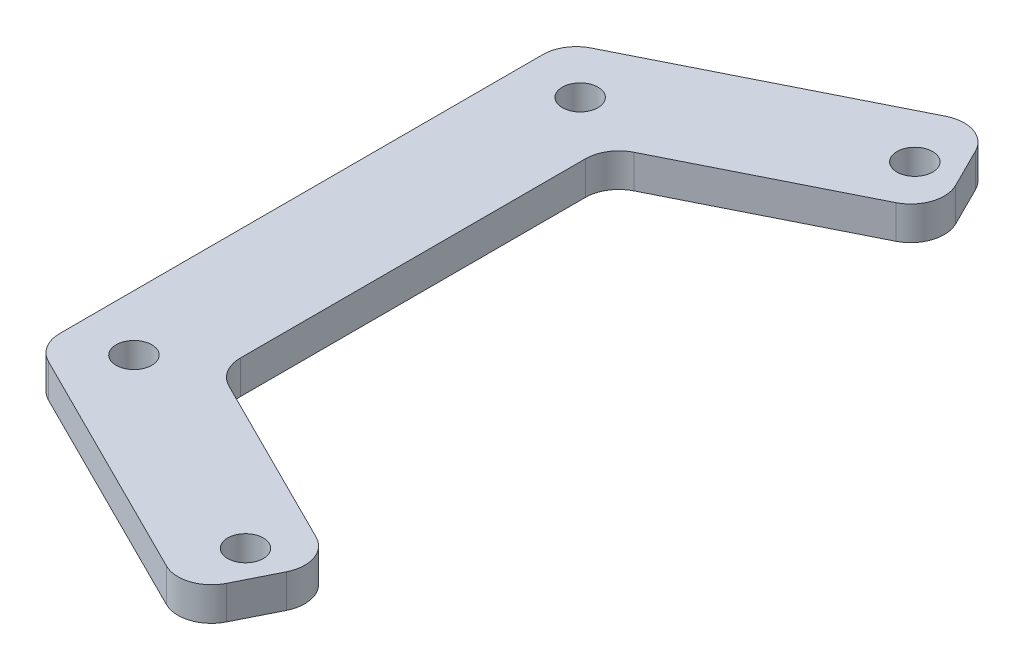
ISO-10303-21;
HEADER;
FILE_DESCRIPTION(('STEP AP214'),'2;1');
FILE_NAME('part.step','',(''),(''),'','','');
FILE_SCHEMA(('AUTOMOTIVE_DESIGN { 1 0 10303 214 1 1 1 1 }'));
ENDSEC;
DATA;
#1=APPLICATION_CONTEXT('core data for automotive mechanical design processes');
#2=APPLICATION_PROTOCOL_DEFINITION('international standard','automotive_design',2000,#1);
#3=PRODUCT_CONTEXT('',#1,'mechanical');
#4=PRODUCT('Part','Part','',(#3));
#5=PRODUCT_RELATED_PRODUCT_CATEGORY('part','',(#4));
#6=PRODUCT_DEFINITION_FORMATION('','',#4);
#7=PRODUCT_DEFINITION_CONTEXT('part definition',#1,'design');
#8=PRODUCT_DEFINITION('design','',#6,#7);
#9=PRODUCT_DEFINITION_SHAPE('','',#8);
#10=(LENGTH_UNIT() NAMED_UNIT(*) SI_UNIT(.MILLI.,.METRE.));
#11=(NAMED_UNIT(*) PLANE_ANGLE_UNIT() SI_UNIT($,.RADIAN.));
#12=(NAMED_UNIT(*) SI_UNIT($,.STERADIAN.) SOLID_ANGLE_UNIT());
#13=UNCERTAINTY_MEASURE_WITH_UNIT(LENGTH_MEASURE(1.E-05),#10,'distance_accuracy_value','');
#14=(GEOMETRIC_REPRESENTATION_CONTEXT(3) GLOBAL_UNCERTAINTY_ASSIGNED_CONTEXT((#13)) GLOBAL_UNIT_ASSIGNED_CONTEXT((#10,
#11,#12)) REPRESENTATION_CONTEXT('',''));
#15=CARTESIAN_POINT('',(0.,0.,0.));
#16=DIRECTION('',(0.,0.,1.));
#17=DIRECTION('',(1.,0.,0.));
#18=AXIS2_PLACEMENT_3D('',#15,#16,#17);
#19=CARTESIAN_POINT('',(-5.92786404500042,3.,11.8557280900009));
#20=DIRECTION('',(-0.447213595499957,0.,0.894427190999916));
#21=DIRECTION('',(0.894427190999916,0.,0.447213595499957));
#22=AXIS2_PLACEMENT_3D('',#19,#20,#21);
#23=PLANE('',#22);
#24=DIRECTION('',(-0.894427190999916,0.,-0.447213595499957));
#25=VECTOR('',#24,1.);
#26=CARTESIAN_POINT('',(-5.92786404500042,0.,11.8557280900009));
#27=LINE('',#26,#25);
#28=CARTESIAN_POINT('',(22.3167184270003,0.,25.9780193260012));
#29=VERTEX_POINT('',#28);
#30=CARTESIAN_POINT('',(6.65835921350013,0.,18.1488397192511));
#31=VERTEX_POINT('',#30);
#32=EDGE_CURVE('E257',#29,#31,#27,.T.);
#33=ORIENTED_EDGE('',*,*,#32,.T.);
#34=DIRECTION('',(0.,-1.,0.));
#35=VECTOR('',#34,1.);
#36=CARTESIAN_POINT('',(6.65835921350013,3.,18.1488397192511));
#37=LINE('',#36,#35);
#38=CARTESIAN_POINT('',(6.65835921350013,3.,18.1488397192511));
#39=VERTEX_POINT('',#38);
#40=EDGE_CURVE('E228',#31,#39,#37,.F.);
#41=ORIENTED_EDGE('',*,*,#40,.T.);
#42=DIRECTION('',(-0.894427190999916,0.,-0.447213595499957));
#43=VECTOR('',#42,1.);
#44=CARTESIAN_POINT('',(-5.92786404500042,3.,11.8557280900009));
#45=LINE('',#44,#43);
#46=CARTESIAN_POINT('',(22.3167184270003,3.,25.9780193260012));
#47=VERTEX_POINT('',#46);
#48=EDGE_CURVE('E275',#47,#39,#45,.T.);
#49=ORIENTED_EDGE('',*,*,#48,.F.);
#50=DIRECTION('',(0.,-1.,0.));
#51=VECTOR('',#50,1.);
#52=CARTESIAN_POINT('',(22.3167184270003,3.,25.9780193260012));
#53=LINE('',#52,#51);
#54=EDGE_CURVE('E225',#47,#29,#53,.T.);
#55=ORIENTED_EDGE('',*,*,#54,.T.);
#56=EDGE_LOOP('',(#33,#41,#49,#55));
#57=FACE_BOUND('',#56,.T.);
#58=ADVANCED_FACE('F35',(#57),#23,.F.);
#59=CARTESIAN_POINT('',(5.,3.,0.));
#60=DIRECTION('',(-1.,0.,0.));
#61=DIRECTION('',(0.,0.,1.));
#62=AXIS2_PLACEMENT_3D('',#59,#60,#61);
#63=PLANE('',#62);
#64=DIRECTION('',(0.,0.,-1.));
#65=VECTOR('',#64,1.);
#66=CARTESIAN_POINT('',(5.,3.,0.));
#67=LINE('',#66,#65);
#68=CARTESIAN_POINT('',(5.,3.,15.4655581462514));
#69=VERTEX_POINT('',#68);
#70=CARTESIAN_POINT('',(5.,3.,-15.4655581462514));
#71=VERTEX_POINT('',#70);
#72=EDGE_CURVE('E266',#69,#71,#67,.T.);
#73=ORIENTED_EDGE('',*,*,#72,.F.);
#74=DIRECTION('',(0.,-1.,0.));
#75=VECTOR('',#74,1.);
#76=CARTESIAN_POINT('',(5.,0.,15.4655581462514));
#77=LINE('',#76,#75);
#78=CARTESIAN_POINT('',(5.,0.,15.4655581462514));
#79=VERTEX_POINT('',#78);
#80=EDGE_CURVE('E222',#69,#79,#77,.T.);
#81=ORIENTED_EDGE('',*,*,#80,.T.);
#82=DIRECTION('',(0.,0.,-1.));
#83=VECTOR('',#82,1.);
#84=CARTESIAN_POINT('',(5.,0.,0.));
#85=LINE('',#84,#83);
#86=CARTESIAN_POINT('',(5.,0.,-15.4655581462514));
#87=VERTEX_POINT('',#86);
#88=EDGE_CURVE('E246',#79,#87,#85,.T.);
#89=ORIENTED_EDGE('',*,*,#88,.T.);
#90=DIRECTION('',(0.,-1.,0.));
#91=VECTOR('',#90,1.);
#92=CARTESIAN_POINT('',(5.,3.,-15.4655581462514));
#93=LINE('',#92,#91);
#94=EDGE_CURVE('E220',#87,#71,#93,.F.);
#95=ORIENTED_EDGE('',*,*,#94,.T.);
#96=EDGE_LOOP('',(#73,#81,#89,#95));
#97=FACE_BOUND('',#96,.T.);
#98=ADVANCED_FACE('F254',(#97),#63,.F.);
#99=CARTESIAN_POINT('',(-5.92786404500042,3.,-11.8557280900009));
#100=DIRECTION('',(-0.447213595499957,0.,-0.894427190999916));
#101=DIRECTION('',(-0.894427190999916,0.,0.447213595499957));
#102=AXIS2_PLACEMENT_3D('',#99,#100,#101);
#103=PLANE('',#102);
#104=DIRECTION('',(0.894427190999916,0.,-0.447213595499957));
#105=VECTOR('',#104,1.);
#106=CARTESIAN_POINT('',(-5.92786404500042,0.,-11.8557280900009));
#107=LINE('',#106,#105);
#108=CARTESIAN_POINT('',(6.65835921350013,0.,-18.1488397192511));
#109=VERTEX_POINT('',#108);
#110=CARTESIAN_POINT('',(22.3167184270003,0.,-25.9780193260012));
#111=VERTEX_POINT('',#110);
#112=EDGE_CURVE('E248',#109,#111,#107,.T.);
#113=ORIENTED_EDGE('',*,*,#112,.T.);
#114=DIRECTION('',(0.,-1.,0.));
#115=VECTOR('',#114,1.);
#116=CARTESIAN_POINT('',(22.3167184270003,3.,-25.9780193260012));
#117=LINE('',#116,#115);
#118=CARTESIAN_POINT('',(22.3167184270003,3.,-25.9780193260012));
#119=VERTEX_POINT('',#118);
#120=EDGE_CURVE('E238',#111,#119,#117,.F.);
#121=ORIENTED_EDGE('',*,*,#120,.T.);
#122=DIRECTION('',(0.894427190999916,0.,-0.447213595499957));
#123=VECTOR('',#122,1.);
#124=CARTESIAN_POINT('',(-5.92786404500042,3.,-11.8557280900009));
#125=LINE('',#124,#123);
#126=CARTESIAN_POINT('',(6.65835921350013,3.,-18.1488397192511));
#127=VERTEX_POINT('',#126);
#128=EDGE_CURVE('E264',#127,#119,#125,.T.);
#129=ORIENTED_EDGE('',*,*,#128,.F.);
#130=DIRECTION('',(0.,-1.,0.));
#131=VECTOR('',#130,1.);
#132=CARTESIAN_POINT('',(6.65835921350013,0.,-18.1488397192511));
#133=LINE('',#132,#131);
#134=EDGE_CURVE('E235',#127,#109,#133,.T.);
#135=ORIENTED_EDGE('',*,*,#134,.T.);
#136=EDGE_LOOP('',(#113,#121,#129,#135));
#137=FACE_BOUND('',#136,.T.);
#138=ADVANCED_FACE('F268',(#137),#103,.F.);
#139=CARTESIAN_POINT('',(30.9278640450004,3.,-15.4639320225002));
#140=DIRECTION('',(-0.894427190999916,0.,0.447213595499958));
#141=DIRECTION('',(0.447213595499958,0.,0.894427190999916));
#142=AXIS2_PLACEMENT_3D('',#139,#140,#141);
#143=PLANE('',#142);
#144=DIRECTION('',(-0.447213595499958,0.,-0.894427190999916));
#145=VECTOR('',#144,1.);
#146=CARTESIAN_POINT('',(30.9278640450004,0.,-15.4639320225002));
#147=LINE('',#146,#145);
#148=CARTESIAN_POINT('',(23.6583592135001,0.,-30.0029416855008));
#149=VERTEX_POINT('',#148);
#150=CARTESIAN_POINT('',(21.8695048315003,0.,-33.5806504495004));
#151=VERTEX_POINT('',#150);
#152=EDGE_CURVE('E181',#149,#151,#147,.T.);
#153=ORIENTED_EDGE('',*,*,#152,.T.);
#154=DIRECTION('',(0.,-1.,0.));
#155=VECTOR('',#154,1.);
#156=CARTESIAN_POINT('',(21.8695048315003,3.,-33.5806504495004));
#157=LINE('',#156,#155);
#158=CARTESIAN_POINT('',(21.8695048315003,3.,-33.5806504495004));
#159=VERTEX_POINT('',#158);
#160=EDGE_CURVE('E233',#151,#159,#157,.F.);
#161=ORIENTED_EDGE('',*,*,#160,.T.);
#162=DIRECTION('',(-0.447213595499958,0.,-0.894427190999916));
#163=VECTOR('',#162,1.);
#164=CARTESIAN_POINT('',(30.9278640450004,3.,-15.4639320225002));
#165=LINE('',#164,#163);
#166=CARTESIAN_POINT('',(23.6583592135001,3.,-30.0029416855008));
#167=VERTEX_POINT('',#166);
#168=EDGE_CURVE('E270',#167,#159,#165,.T.);
#169=ORIENTED_EDGE('',*,*,#168,.F.);
#170=DIRECTION('',(0.,-1.,0.));
#171=VECTOR('',#170,1.);
#172=CARTESIAN_POINT('',(23.6583592135001,3.,-30.0029416855008));
#173=LINE('',#172,#171);
#174=EDGE_CURVE('E230',#167,#149,#173,.T.);
#175=ORIENTED_EDGE('',*,*,#174,.T.);
#176=EDGE_LOOP('',(#153,#161,#169,#175));
#177=FACE_BOUND('',#176,.T.);
#178=ADVANCED_FACE('F303',(#177),#143,.F.);
#179=CARTESIAN_POINT('',(-10.4,3.,-20.8));
#180=DIRECTION('',(-0.447213595499958,0.,-0.894427190999916));
#181=DIRECTION('',(-0.894427190999916,0.,0.447213595499958));
#182=AXIS2_PLACEMENT_3D('',#179,#180,#181);
#183=PLANE('',#182);
#184=DIRECTION('',(0.894427190999916,0.,-0.447213595499958));
#185=VECTOR('',#184,1.);
#186=CARTESIAN_POINT('',(-10.4,0.,-20.8));
#187=LINE('',#186,#185);
#188=CARTESIAN_POINT('',(-3.34164078649988,0.,-24.3291796067501));
#189=VERTEX_POINT('',#188);
#190=CARTESIAN_POINT('',(17.8445824720007,0.,-34.9222912360003));
#191=VERTEX_POINT('',#190);
#192=EDGE_CURVE('E176',#189,#191,#187,.T.);
#193=ORIENTED_EDGE('',*,*,#192,.F.);
#194=DIRECTION('',(0.,-1.,0.));
#195=VECTOR('',#194,1.);
#196=CARTESIAN_POINT('',(-3.34164078649988,3.,-24.3291796067501));
#197=LINE('',#196,#195);
#198=CARTESIAN_POINT('',(-3.34164078649988,3.,-24.3291796067501));
#199=VERTEX_POINT('',#198);
#200=EDGE_CURVE('E154',#189,#199,#197,.F.);
#201=ORIENTED_EDGE('',*,*,#200,.T.);
#202=DIRECTION('',(0.894427190999916,0.,-0.447213595499958));
#203=VECTOR('',#202,1.);
#204=CARTESIAN_POINT('',(-10.4,3.,-20.8));
#205=LINE('',#204,#203);
#206=CARTESIAN_POINT('',(17.8445824720007,3.,-34.9222912360003));
#207=VERTEX_POINT('',#206);
#208=EDGE_CURVE('E273',#199,#207,#205,.T.);
#209=ORIENTED_EDGE('',*,*,#208,.T.);
#210=DIRECTION('',(0.,-1.,0.));
#211=VECTOR('',#210,1.);
#212=CARTESIAN_POINT('',(17.8445824720007,0.,-34.9222912360003));
#213=LINE('',#212,#211);
#214=EDGE_CURVE('E159',#207,#191,#213,.T.);
#215=ORIENTED_EDGE('',*,*,#214,.T.);
#216=EDGE_LOOP('',(#193,#201,#209,#215));
#217=FACE_BOUND('',#216,.T.);
#218=ADVANCED_FACE('F311',(#217),#183,.T.);
#219=CARTESIAN_POINT('',(-5.,3.,0.));
#220=DIRECTION('',(1.,0.,0.));
#221=DIRECTION('',(0.,0.,-1.));
#222=AXIS2_PLACEMENT_3D('',#219,#220,#221);
#223=PLANE('',#222);
#224=DIRECTION('',(0.,0.,1.));
#225=VECTOR('',#224,1.);
#226=CARTESIAN_POINT('',(-5.,3.,0.));
#227=LINE('',#226,#225);
#228=CARTESIAN_POINT('',(-5.,3.,-21.6458980337503));
#229=VERTEX_POINT('',#228);
#230=CARTESIAN_POINT('',(-5.,3.,21.6458980337503));
#231=VERTEX_POINT('',#230);
#232=EDGE_CURVE('E169',#229,#231,#227,.T.);
#233=ORIENTED_EDGE('',*,*,#232,.F.);
#234=DIRECTION('',(0.,-1.,0.));
#235=VECTOR('',#234,1.);
#236=CARTESIAN_POINT('',(-5.,0.,-21.6458980337503));
#237=LINE('',#236,#235);
#238=CARTESIAN_POINT('',(-5.,0.,-21.6458980337503));
#239=VERTEX_POINT('',#238);
#240=EDGE_CURVE('E153',#229,#239,#237,.T.);
#241=ORIENTED_EDGE('',*,*,#240,.T.);
#242=DIRECTION('',(0.,0.,1.));
#243=VECTOR('',#242,1.);
#244=CARTESIAN_POINT('',(-5.,0.,0.));
#245=LINE('',#244,#243);
#246=CARTESIAN_POINT('',(-5.,0.,21.6458980337503));
#247=VERTEX_POINT('',#246);
#248=EDGE_CURVE('E166',#239,#247,#245,.T.);
#249=ORIENTED_EDGE('',*,*,#248,.T.);
#250=DIRECTION('',(0.,-1.,0.));
#251=VECTOR('',#250,1.);
#252=CARTESIAN_POINT('',(-5.,3.,21.6458980337503));
#253=LINE('',#252,#251);
#254=EDGE_CURVE('E171',#247,#231,#253,.F.);
#255=ORIENTED_EDGE('',*,*,#254,.T.);
#256=EDGE_LOOP('',(#233,#241,#249,#255));
#257=FACE_BOUND('',#256,.T.);
#258=ADVANCED_FACE('F165',(#257),#223,.F.);
#259=CARTESIAN_POINT('',(-10.4,3.,20.8));
#260=DIRECTION('',(0.447213595499958,0.,-0.894427190999916));
#261=DIRECTION('',(-0.894427190999916,0.,-0.447213595499958));
#262=AXIS2_PLACEMENT_3D('',#259,#260,#261);
#263=PLANE('',#262);
#264=DIRECTION('',(0.894427190999916,0.,0.447213595499958));
#265=VECTOR('',#264,1.);
#266=CARTESIAN_POINT('',(-10.4,3.,20.8));
#267=LINE('',#266,#265);
#268=CARTESIAN_POINT('',(-3.34164078649987,3.,24.3291796067501));
#269=VERTEX_POINT('',#268);
#270=CARTESIAN_POINT('',(17.8445824720007,3.,34.9222912360003));
#271=VERTEX_POINT('',#270);
#272=EDGE_CURVE('E282',#269,#271,#267,.T.);
#273=ORIENTED_EDGE('',*,*,#272,.F.);
#274=DIRECTION('',(0.,-1.,0.));
#275=VECTOR('',#274,1.);
#276=CARTESIAN_POINT('',(-3.34164078649987,3.,24.3291796067501));
#277=LINE('',#276,#275);
#278=CARTESIAN_POINT('',(-3.34164078649987,0.,24.3291796067501));
#279=VERTEX_POINT('',#278);
#280=EDGE_CURVE('E213',#269,#279,#277,.T.);
#281=ORIENTED_EDGE('',*,*,#280,.T.);
#282=DIRECTION('',(0.894427190999916,0.,0.447213595499958));
#283=VECTOR('',#282,1.);
#284=CARTESIAN_POINT('',(-10.4,0.,20.8));
#285=LINE('',#284,#283);
#286=CARTESIAN_POINT('',(17.8445824720007,0.,34.9222912360003));
#287=VERTEX_POINT('',#286);
#288=EDGE_CURVE('E175',#279,#287,#285,.T.);
#289=ORIENTED_EDGE('',*,*,#288,.T.);
#290=DIRECTION('',(0.,-1.,0.));
#291=VECTOR('',#290,1.);
#292=CARTESIAN_POINT('',(17.8445824720007,3.,34.9222912360003));
#293=LINE('',#292,#291);
#294=EDGE_CURVE('E211',#287,#271,#293,.F.);
#295=ORIENTED_EDGE('',*,*,#294,.T.);
#296=EDGE_LOOP('',(#273,#281,#289,#295));
#297=FACE_BOUND('',#296,.T.);
#298=ADVANCED_FACE('F318',(#297),#263,.F.);
#299=CARTESIAN_POINT('',(0.,3.,-20.));
#300=DIRECTION('',(0.,-1.,0.));
#301=DIRECTION('',(0.,0.,-1.));
#302=AXIS2_PLACEMENT_3D('',#299,#300,#301);
#303=CYLINDRICAL_SURFACE('',#302,1.6);
#304=CARTESIAN_POINT('',(0.,3.,-20.));
#305=DIRECTION('',(0.,1.,0.));
#306=DIRECTION('',(0.,0.,1.));
#307=AXIS2_PLACEMENT_3D('',#304,#305,#306);
#308=CIRCLE('',#307,1.6);
#309=CARTESIAN_POINT('',(0.,3.,-18.4));
#310=VERTEX_POINT('',#309);
#311=EDGE_CURVE('E523',#310,#310,#308,.T.);
#312=ORIENTED_EDGE('',*,*,#311,.T.);
#313=EDGE_LOOP('',(#312));
#314=FACE_BOUND('',#313,.T.);
#315=CARTESIAN_POINT('',(0.,0.,-20.));
#316=DIRECTION('',(0.,1.,0.));
#317=DIRECTION('',(0.,0.,1.));
#318=AXIS2_PLACEMENT_3D('',#315,#316,#317);
#319=CIRCLE('',#318,1.6);
#320=CARTESIAN_POINT('',(0.,0.,-18.4));
#321=VERTEX_POINT('',#320);
#322=EDGE_CURVE('E294',#321,#321,#319,.T.);
#323=ORIENTED_EDGE('',*,*,#322,.F.);
#324=EDGE_LOOP('',(#323));
#325=FACE_BOUND('',#324,.T.);
#326=ADVANCED_FACE('F330',(#314,#325),#303,.F.);
#327=CARTESIAN_POINT('',(0.,3.,20.));
#328=DIRECTION('',(0.,-1.,0.));
#329=DIRECTION('',(0.,0.,-1.));
#330=AXIS2_PLACEMENT_3D('',#327,#328,#329);
#331=CYLINDRICAL_SURFACE('',#330,1.6);
#332=CARTESIAN_POINT('',(0.,3.,20.));
#333=DIRECTION('',(0.,1.,0.));
#334=DIRECTION('',(0.,0.,1.));
#335=AXIS2_PLACEMENT_3D('',#332,#333,#334);
#336=CIRCLE('',#335,1.6);
#337=CARTESIAN_POINT('',(0.,3.,21.6));
#338=VERTEX_POINT('',#337);
#339=EDGE_CURVE('E525',#338,#338,#336,.T.);
#340=ORIENTED_EDGE('',*,*,#339,.T.);
#341=EDGE_LOOP('',(#340));
#342=FACE_BOUND('',#341,.T.);
#343=CARTESIAN_POINT('',(0.,0.,20.));
#344=DIRECTION('',(0.,1.,0.));
#345=DIRECTION('',(0.,0.,1.));
#346=AXIS2_PLACEMENT_3D('',#343,#344,#345);
#347=CIRCLE('',#346,1.6);
#348=CARTESIAN_POINT('',(0.,0.,21.6));
#349=VERTEX_POINT('',#348);
#350=EDGE_CURVE('E291',#349,#349,#347,.T.);
#351=ORIENTED_EDGE('',*,*,#350,.F.);
#352=EDGE_LOOP('',(#351));
#353=FACE_BOUND('',#352,.T.);
#354=ADVANCED_FACE('F333',(#342,#353),#331,.F.);
#355=CARTESIAN_POINT('',(20.,3.,-30.));
#356=DIRECTION('',(0.,-1.,0.));
#357=DIRECTION('',(0.,0.,-1.));
#358=AXIS2_PLACEMENT_3D('',#355,#356,#357);
#359=CYLINDRICAL_SURFACE('',#358,1.6);
#360=CARTESIAN_POINT('',(20.,3.,-30.));
#361=DIRECTION('',(0.,1.,0.));
#362=DIRECTION('',(0.,0.,1.));
#363=AXIS2_PLACEMENT_3D('',#360,#361,#362);
#364=CIRCLE('',#363,1.6);
#365=CARTESIAN_POINT('',(20.,3.,-28.4));
#366=VERTEX_POINT('',#365);
#367=EDGE_CURVE('E530',#366,#366,#364,.T.);
#368=ORIENTED_EDGE('',*,*,#367,.T.);
#369=EDGE_LOOP('',(#368));
#370=FACE_BOUND('',#369,.T.);
#371=CARTESIAN_POINT('',(20.,0.,-30.));
#372=DIRECTION('',(0.,1.,0.));
#373=DIRECTION('',(0.,0.,1.));
#374=AXIS2_PLACEMENT_3D('',#371,#372,#373);
#375=CIRCLE('',#374,1.6);
#376=CARTESIAN_POINT('',(20.,0.,-28.4));
#377=VERTEX_POINT('',#376);
#378=EDGE_CURVE('E288',#377,#377,#375,.T.);
#379=ORIENTED_EDGE('',*,*,#378,.F.);
#380=EDGE_LOOP('',(#379));
#381=FACE_BOUND('',#380,.T.);
#382=ADVANCED_FACE('F337',(#370,#381),#359,.F.);
#383=CARTESIAN_POINT('',(20.,3.,30.));
#384=DIRECTION('',(0.,-1.,0.));
#385=DIRECTION('',(0.,0.,-1.));
#386=AXIS2_PLACEMENT_3D('',#383,#384,#385);
#387=CYLINDRICAL_SURFACE('',#386,1.6);
#388=CARTESIAN_POINT('',(20.,3.,30.));
#389=DIRECTION('',(0.,1.,0.));
#390=DIRECTION('',(0.,0.,1.));
#391=AXIS2_PLACEMENT_3D('',#388,#389,#390);
#392=CIRCLE('',#391,1.6);
#393=CARTESIAN_POINT('',(20.,3.,31.6));
#394=VERTEX_POINT('',#393);
#395=EDGE_CURVE('E186',#394,#394,#392,.T.);
#396=ORIENTED_EDGE('',*,*,#395,.T.);
#397=EDGE_LOOP('',(#396));
#398=FACE_BOUND('',#397,.T.);
#399=CARTESIAN_POINT('',(20.,0.,30.));
#400=DIRECTION('',(0.,1.,0.));
#401=DIRECTION('',(0.,0.,1.));
#402=AXIS2_PLACEMENT_3D('',#399,#400,#401);
#403=CIRCLE('',#402,1.6);
#404=CARTESIAN_POINT('',(20.,0.,31.6));
#405=VERTEX_POINT('',#404);
#406=EDGE_CURVE('E285',#405,#405,#403,.T.);
#407=ORIENTED_EDGE('',*,*,#406,.F.);
#408=EDGE_LOOP('',(#407));
#409=FACE_BOUND('',#408,.T.);
#410=ADVANCED_FACE('F341',(#398,#409),#387,.F.);
#411=CARTESIAN_POINT('',(30.9278640450004,3.,15.4639320225002));
#412=DIRECTION('',(-0.894427190999916,0.,-0.447213595499957));
#413=DIRECTION('',(-0.447213595499957,0.,0.894427190999916));
#414=AXIS2_PLACEMENT_3D('',#411,#412,#413);
#415=PLANE('',#414);
#416=DIRECTION('',(0.447213595499957,0.,-0.894427190999916));
#417=VECTOR('',#416,1.);
#418=CARTESIAN_POINT('',(30.9278640450004,3.,15.4639320225002));
#419=LINE('',#418,#417);
#420=CARTESIAN_POINT('',(21.8695048315003,3.,33.5806504495005));
#421=VERTEX_POINT('',#420);
#422=CARTESIAN_POINT('',(23.6583592135001,3.,30.0029416855008));
#423=VERTEX_POINT('',#422);
#424=EDGE_CURVE('E187',#421,#423,#419,.T.);
#425=ORIENTED_EDGE('',*,*,#424,.F.);
#426=DIRECTION('',(0.,-1.,0.));
#427=VECTOR('',#426,1.);
#428=CARTESIAN_POINT('',(21.8695048315003,3.,33.5806504495005));
#429=LINE('',#428,#427);
#430=CARTESIAN_POINT('',(21.8695048315003,0.,33.5806504495005));
#431=VERTEX_POINT('',#430);
#432=EDGE_CURVE('E217',#421,#431,#429,.T.);
#433=ORIENTED_EDGE('',*,*,#432,.T.);
#434=DIRECTION('',(0.447213595499957,0.,-0.894427190999916));
#435=VECTOR('',#434,1.);
#436=CARTESIAN_POINT('',(30.9278640450004,0.,15.4639320225002));
#437=LINE('',#436,#435);
#438=CARTESIAN_POINT('',(23.6583592135001,0.,30.0029416855008));
#439=VERTEX_POINT('',#438);
#440=EDGE_CURVE('E179',#431,#439,#437,.T.);
#441=ORIENTED_EDGE('',*,*,#440,.T.);
#442=DIRECTION('',(0.,-1.,0.));
#443=VECTOR('',#442,1.);
#444=CARTESIAN_POINT('',(23.6583592135001,3.,30.0029416855008));
#445=LINE('',#444,#443);
#446=EDGE_CURVE('E50',#439,#423,#445,.F.);
#447=ORIENTED_EDGE('',*,*,#446,.T.);
#448=EDGE_LOOP('',(#425,#433,#441,#447));
#449=FACE_BOUND('',#448,.T.);
#450=ADVANCED_FACE('F345',(#449),#415,.F.);
#451=CARTESIAN_POINT('',(0.,3.,0.));
#452=DIRECTION('',(0.,1.,0.));
#453=DIRECTION('',(0.,0.,1.));
#454=AXIS2_PLACEMENT_3D('',#451,#452,#453);
#455=PLANE('',#454);
#456=ORIENTED_EDGE('',*,*,#395,.F.);
#457=EDGE_LOOP('',(#456));
#458=FACE_BOUND('',#457,.T.);
#459=ORIENTED_EDGE('',*,*,#367,.F.);
#460=EDGE_LOOP('',(#459));
#461=FACE_BOUND('',#460,.T.);
#462=ORIENTED_EDGE('',*,*,#339,.F.);
#463=EDGE_LOOP('',(#462));
#464=FACE_BOUND('',#463,.T.);
#465=ORIENTED_EDGE('',*,*,#311,.F.);
#466=EDGE_LOOP('',(#465));
#467=FACE_BOUND('',#466,.T.);
#468=ORIENTED_EDGE('',*,*,#208,.F.);
#469=CARTESIAN_POINT('',(-2.,3.,-21.6458980337503));
#470=DIRECTION('',(0.,1.,0.));
#471=DIRECTION('',(0.,0.,1.));
#472=AXIS2_PLACEMENT_3D('',#469,#470,#471);
#473=CIRCLE('',#472,3.);
#474=EDGE_CURVE('E209',#199,#229,#473,.T.);
#475=ORIENTED_EDGE('',*,*,#474,.T.);
#476=ORIENTED_EDGE('',*,*,#232,.T.);
#477=CARTESIAN_POINT('',(-2.,3.,21.6458980337503));
#478=DIRECTION('',(0.,1.,0.));
#479=DIRECTION('',(0.,0.,1.));
#480=AXIS2_PLACEMENT_3D('',#477,#478,#479);
#481=CIRCLE('',#480,3.);
#482=EDGE_CURVE('E207',#231,#269,#481,.T.);
#483=ORIENTED_EDGE('',*,*,#482,.T.);
#484=ORIENTED_EDGE('',*,*,#272,.T.);
#485=CARTESIAN_POINT('',(19.1862232585006,3.,32.2390096630006));
#486=DIRECTION('',(0.,1.,0.));
#487=DIRECTION('',(0.,0.,1.));
#488=AXIS2_PLACEMENT_3D('',#485,#486,#487);
#489=CIRCLE('',#488,3.);
#490=EDGE_CURVE('E57',#271,#421,#489,.T.);
#491=ORIENTED_EDGE('',*,*,#490,.T.);
#492=ORIENTED_EDGE('',*,*,#424,.T.);
#493=CARTESIAN_POINT('',(20.9750776405004,3.,28.6613008990009));
#494=DIRECTION('',(0.,1.,0.));
#495=DIRECTION('',(0.,0.,1.));
#496=AXIS2_PLACEMENT_3D('',#493,#494,#495);
#497=CIRCLE('',#496,3.);
#498=EDGE_CURVE('E204',#423,#47,#497,.T.);
#499=ORIENTED_EDGE('',*,*,#498,.T.);
#500=ORIENTED_EDGE('',*,*,#48,.T.);
#501=CARTESIAN_POINT('',(8.,3.,15.4655581462514));
#502=DIRECTION('',(0.,1.,0.));
#503=DIRECTION('',(0.,0.,1.));
#504=AXIS2_PLACEMENT_3D('',#501,#502,#503);
#505=CIRCLE('',#504,3.);
#506=EDGE_CURVE('E242',#39,#69,#505,.F.);
#507=ORIENTED_EDGE('',*,*,#506,.T.);
#508=ORIENTED_EDGE('',*,*,#72,.T.);
#509=CARTESIAN_POINT('',(8.,3.,-15.4655581462514));
#510=DIRECTION('',(0.,1.,0.));
#511=DIRECTION('',(0.,0.,1.));
#512=AXIS2_PLACEMENT_3D('',#509,#510,#511);
#513=CIRCLE('',#512,3.);
#514=EDGE_CURVE('E11',#71,#127,#513,.F.);
#515=ORIENTED_EDGE('',*,*,#514,.T.);
#516=ORIENTED_EDGE('',*,*,#128,.T.);
#517=CARTESIAN_POINT('',(20.9750776405004,3.,-28.6613008990009));
#518=DIRECTION('',(0.,1.,0.));
#519=DIRECTION('',(0.,0.,1.));
#520=AXIS2_PLACEMENT_3D('',#517,#518,#519);
#521=CIRCLE('',#520,3.);
#522=EDGE_CURVE('E200',#119,#167,#521,.T.);
#523=ORIENTED_EDGE('',*,*,#522,.T.);
#524=ORIENTED_EDGE('',*,*,#168,.T.);
#525=CARTESIAN_POINT('',(19.1862232585005,3.,-32.2390096630006));
#526=DIRECTION('',(0.,1.,0.));
#527=DIRECTION('',(0.,0.,1.));
#528=AXIS2_PLACEMENT_3D('',#525,#526,#527);
#529=CIRCLE('',#528,3.);
#530=EDGE_CURVE('E202',#159,#207,#529,.T.);
#531=ORIENTED_EDGE('',*,*,#530,.T.);
#532=EDGE_LOOP('',(#468,#475,#476,#483,#484,#491,#492,#499,#500,#507,#508,#515,#516,#523,#524,#531));
#533=FACE_BOUND('',#532,.T.);
#534=ADVANCED_FACE('F263',(#458,#461,#464,#467,#533),#455,.T.);
#535=CARTESIAN_POINT('',(0.,0.,0.));
#536=DIRECTION('',(0.,1.,0.));
#537=DIRECTION('',(0.,0.,1.));
#538=AXIS2_PLACEMENT_3D('',#535,#536,#537);
#539=PLANE('',#538);
#540=ORIENTED_EDGE('',*,*,#406,.T.);
#541=EDGE_LOOP('',(#540));
#542=FACE_BOUND('',#541,.T.);
#543=ORIENTED_EDGE('',*,*,#378,.T.);
#544=EDGE_LOOP('',(#543));
#545=FACE_BOUND('',#544,.T.);
#546=ORIENTED_EDGE('',*,*,#350,.T.);
#547=EDGE_LOOP('',(#546));
#548=FACE_BOUND('',#547,.T.);
#549=ORIENTED_EDGE('',*,*,#322,.T.);
#550=EDGE_LOOP('',(#549));
#551=FACE_BOUND('',#550,.T.);
#552=ORIENTED_EDGE('',*,*,#248,.F.);
#553=CARTESIAN_POINT('',(-2.,0.,-21.6458980337503));
#554=DIRECTION('',(0.,1.,0.));
#555=DIRECTION('',(0.,0.,1.));
#556=AXIS2_PLACEMENT_3D('',#553,#554,#555);
#557=CIRCLE('',#556,3.);
#558=EDGE_CURVE('E149',#239,#189,#557,.F.);
#559=ORIENTED_EDGE('',*,*,#558,.T.);
#560=ORIENTED_EDGE('',*,*,#192,.T.);
#561=CARTESIAN_POINT('',(19.1862232585005,0.,-32.2390096630006));
#562=DIRECTION('',(0.,1.,0.));
#563=DIRECTION('',(0.,0.,1.));
#564=AXIS2_PLACEMENT_3D('',#561,#562,#563);
#565=CIRCLE('',#564,3.);
#566=EDGE_CURVE('E190',#191,#151,#565,.F.);
#567=ORIENTED_EDGE('',*,*,#566,.T.);
#568=ORIENTED_EDGE('',*,*,#152,.F.);
#569=CARTESIAN_POINT('',(20.9750776405004,0.,-28.6613008990009));
#570=DIRECTION('',(0.,1.,0.));
#571=DIRECTION('',(0.,0.,1.));
#572=AXIS2_PLACEMENT_3D('',#569,#570,#571);
#573=CIRCLE('',#572,3.);
#574=EDGE_CURVE('E170',#149,#111,#573,.F.);
#575=ORIENTED_EDGE('',*,*,#574,.T.);
#576=ORIENTED_EDGE('',*,*,#112,.F.);
#577=CARTESIAN_POINT('',(8.,0.,-15.4655581462514));
#578=DIRECTION('',(0.,1.,0.));
#579=DIRECTION('',(0.,0.,1.));
#580=AXIS2_PLACEMENT_3D('',#577,#578,#579);
#581=CIRCLE('',#580,3.);
#582=EDGE_CURVE('E43',#109,#87,#581,.T.);
#583=ORIENTED_EDGE('',*,*,#582,.T.);
#584=ORIENTED_EDGE('',*,*,#88,.F.);
#585=CARTESIAN_POINT('',(8.,0.,15.4655581462514));
#586=DIRECTION('',(0.,1.,0.));
#587=DIRECTION('',(0.,0.,1.));
#588=AXIS2_PLACEMENT_3D('',#585,#586,#587);
#589=CIRCLE('',#588,3.);
#590=EDGE_CURVE('E240',#79,#31,#589,.T.);
#591=ORIENTED_EDGE('',*,*,#590,.T.);
#592=ORIENTED_EDGE('',*,*,#32,.F.);
#593=CARTESIAN_POINT('',(20.9750776405004,0.,28.6613008990009));
#594=DIRECTION('',(0.,1.,0.));
#595=DIRECTION('',(0.,0.,1.));
#596=AXIS2_PLACEMENT_3D('',#593,#594,#595);
#597=CIRCLE('',#596,3.);
#598=EDGE_CURVE('E192',#29,#439,#597,.F.);
#599=ORIENTED_EDGE('',*,*,#598,.T.);
#600=ORIENTED_EDGE('',*,*,#440,.F.);
#601=CARTESIAN_POINT('',(19.1862232585006,0.,32.2390096630006));
#602=DIRECTION('',(0.,1.,0.));
#603=DIRECTION('',(0.,0.,1.));
#604=AXIS2_PLACEMENT_3D('',#601,#602,#603);
#605=CIRCLE('',#604,3.);
#606=EDGE_CURVE('E194',#431,#287,#605,.F.);
#607=ORIENTED_EDGE('',*,*,#606,.T.);
#608=ORIENTED_EDGE('',*,*,#288,.F.);
#609=CARTESIAN_POINT('',(-2.,0.,21.6458980337503));
#610=DIRECTION('',(0.,1.,0.));
#611=DIRECTION('',(0.,0.,1.));
#612=AXIS2_PLACEMENT_3D('',#609,#610,#611);
#613=CIRCLE('',#612,3.);
#614=EDGE_CURVE('E160',#279,#247,#613,.F.);
#615=ORIENTED_EDGE('',*,*,#614,.T.);
#616=EDGE_LOOP('',(#552,#559,#560,#567,#568,#575,#576,#583,#584,#591,#592,#599,#600,#607,#608,#615));
#617=FACE_BOUND('',#616,.T.);
#618=ADVANCED_FACE('F173',(#542,#545,#548,#551,#617),#539,.F.);
#619=CARTESIAN_POINT('',(-2.,3.,-21.6458980337503));
#620=DIRECTION('',(0.,1.,0.));
#621=DIRECTION('',(0.,0.,1.));
#622=AXIS2_PLACEMENT_3D('',#619,#620,#621);
#623=CYLINDRICAL_SURFACE('',#622,3.);
#624=ORIENTED_EDGE('',*,*,#474,.F.);
#625=ORIENTED_EDGE('',*,*,#200,.F.);
#626=ORIENTED_EDGE('',*,*,#558,.F.);
#627=ORIENTED_EDGE('',*,*,#240,.F.);
#628=EDGE_LOOP('',(#624,#625,#626,#627));
#629=FACE_BOUND('',#628,.T.);
#630=ADVANCED_FACE('F152',(#629),#623,.T.);
#631=CARTESIAN_POINT('',(-2.,3.,21.6458980337503));
#632=DIRECTION('',(0.,-1.,0.));
#633=DIRECTION('',(0.,0.,-1.));
#634=AXIS2_PLACEMENT_3D('',#631,#632,#633);
#635=CYLINDRICAL_SURFACE('',#634,3.);
#636=ORIENTED_EDGE('',*,*,#482,.F.);
#637=ORIENTED_EDGE('',*,*,#254,.F.);
#638=ORIENTED_EDGE('',*,*,#614,.F.);
#639=ORIENTED_EDGE('',*,*,#280,.F.);
#640=EDGE_LOOP('',(#636,#637,#638,#639));
#641=FACE_BOUND('',#640,.T.);
#642=ADVANCED_FACE('F349',(#641),#635,.T.);
#643=CARTESIAN_POINT('',(19.1862232585006,3.,32.2390096630006));
#644=DIRECTION('',(0.,-1.,0.));
#645=DIRECTION('',(0.,0.,-1.));
#646=AXIS2_PLACEMENT_3D('',#643,#644,#645);
#647=CYLINDRICAL_SURFACE('',#646,3.);
#648=ORIENTED_EDGE('',*,*,#490,.F.);
#649=ORIENTED_EDGE('',*,*,#294,.F.);
#650=ORIENTED_EDGE('',*,*,#606,.F.);
#651=ORIENTED_EDGE('',*,*,#432,.F.);
#652=EDGE_LOOP('',(#648,#649,#650,#651));
#653=FACE_BOUND('',#652,.T.);
#654=ADVANCED_FACE('F352',(#653),#647,.T.);
#655=CARTESIAN_POINT('',(8.,3.,15.4655581462514));
#656=DIRECTION('',(0.,1.,0.));
#657=DIRECTION('',(0.,0.,1.));
#658=AXIS2_PLACEMENT_3D('',#655,#656,#657);
#659=CYLINDRICAL_SURFACE('',#658,3.);
#660=ORIENTED_EDGE('',*,*,#506,.F.);
#661=ORIENTED_EDGE('',*,*,#40,.F.);
#662=ORIENTED_EDGE('',*,*,#590,.F.);
#663=ORIENTED_EDGE('',*,*,#80,.F.);
#664=EDGE_LOOP('',(#660,#661,#662,#663));
#665=FACE_BOUND('',#664,.T.);
#666=ADVANCED_FACE('F356',(#665),#659,.F.);
#667=CARTESIAN_POINT('',(20.9750776405004,3.,28.6613008990009));
#668=DIRECTION('',(0.,-1.,0.));
#669=DIRECTION('',(0.,0.,-1.));
#670=AXIS2_PLACEMENT_3D('',#667,#668,#669);
#671=CYLINDRICAL_SURFACE('',#670,3.);
#672=ORIENTED_EDGE('',*,*,#498,.F.);
#673=ORIENTED_EDGE('',*,*,#446,.F.);
#674=ORIENTED_EDGE('',*,*,#598,.F.);
#675=ORIENTED_EDGE('',*,*,#54,.F.);
#676=EDGE_LOOP('',(#672,#673,#674,#675));
#677=FACE_BOUND('',#676,.T.);
#678=ADVANCED_FACE('F360',(#677),#671,.T.);
#679=CARTESIAN_POINT('',(19.1862232585005,3.,-32.2390096630006));
#680=DIRECTION('',(0.,1.,0.));
#681=DIRECTION('',(0.,0.,1.));
#682=AXIS2_PLACEMENT_3D('',#679,#680,#681);
#683=CYLINDRICAL_SURFACE('',#682,3.);
#684=ORIENTED_EDGE('',*,*,#530,.F.);
#685=ORIENTED_EDGE('',*,*,#160,.F.);
#686=ORIENTED_EDGE('',*,*,#566,.F.);
#687=ORIENTED_EDGE('',*,*,#214,.F.);
#688=EDGE_LOOP('',(#684,#685,#686,#687));
#689=FACE_BOUND('',#688,.T.);
#690=ADVANCED_FACE('F308',(#689),#683,.T.);
#691=CARTESIAN_POINT('',(20.9750776405004,3.,-28.6613008990009));
#692=DIRECTION('',(0.,-1.,0.));
#693=DIRECTION('',(0.,0.,-1.));
#694=AXIS2_PLACEMENT_3D('',#691,#692,#693);
#695=CYLINDRICAL_SURFACE('',#694,3.);
#696=ORIENTED_EDGE('',*,*,#522,.F.);
#697=ORIENTED_EDGE('',*,*,#120,.F.);
#698=ORIENTED_EDGE('',*,*,#574,.F.);
#699=ORIENTED_EDGE('',*,*,#174,.F.);
#700=EDGE_LOOP('',(#696,#697,#698,#699));
#701=FACE_BOUND('',#700,.T.);
#702=ADVANCED_FACE('F366',(#701),#695,.T.);
#703=CARTESIAN_POINT('',(8.,3.,-15.4655581462514));
#704=DIRECTION('',(0.,1.,0.));
#705=DIRECTION('',(0.,0.,1.));
#706=AXIS2_PLACEMENT_3D('',#703,#704,#705);
#707=CYLINDRICAL_SURFACE('',#706,3.);
#708=ORIENTED_EDGE('',*,*,#514,.F.);
#709=ORIENTED_EDGE('',*,*,#94,.F.);
#710=ORIENTED_EDGE('',*,*,#582,.F.);
#711=ORIENTED_EDGE('',*,*,#134,.F.);
#712=EDGE_LOOP('',(#708,#709,#710,#711));
#713=FACE_BOUND('',#712,.T.);
#714=ADVANCED_FACE('F37',(#713),#707,.F.);
#715=CLOSED_SHELL('',(#58,#98,#138,#178,#218,#258,#298,#326,#354,#382,#410,#450,#534,#618,#630,
#642,#654,#666,#678,#690,#702,#714));
#716=MANIFOLD_SOLID_BREP('B2',#715);
#717=ADVANCED_BREP_SHAPE_REPRESENTATION('',(#18,#716),#14);
#718=SHAPE_DEFINITION_REPRESENTATION(#9,#717);
ENDSEC;
END-ISO-10303-21;
